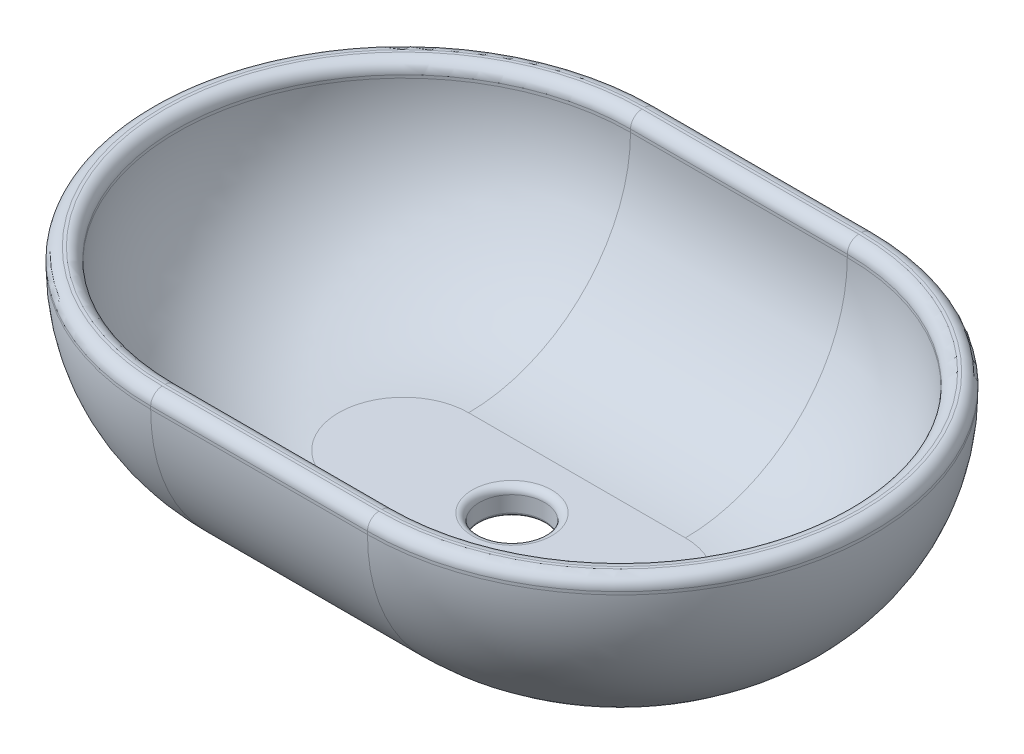
ISO-10303-21;
HEADER;
FILE_DESCRIPTION(('STEP AP214'),'2;1');
FILE_NAME('part.step','',(''),(''),'','','');
FILE_SCHEMA(('AUTOMOTIVE_DESIGN { 1 0 10303 214 1 1 1 1 }'));
ENDSEC;
DATA;
#1=APPLICATION_CONTEXT('core data for automotive mechanical design processes');
#2=APPLICATION_PROTOCOL_DEFINITION('international standard','automotive_design',2000,#1);
#3=PRODUCT_CONTEXT('',#1,'mechanical');
#4=PRODUCT('Part','Part','',(#3));
#5=PRODUCT_RELATED_PRODUCT_CATEGORY('part','',(#4));
#6=PRODUCT_DEFINITION_FORMATION('','',#4);
#7=PRODUCT_DEFINITION_CONTEXT('part definition',#1,'design');
#8=PRODUCT_DEFINITION('design','',#6,#7);
#9=PRODUCT_DEFINITION_SHAPE('','',#8);
#10=(LENGTH_UNIT() NAMED_UNIT(*) SI_UNIT(.MILLI.,.METRE.));
#11=(NAMED_UNIT(*) PLANE_ANGLE_UNIT() SI_UNIT($,.RADIAN.));
#12=(NAMED_UNIT(*) SI_UNIT($,.STERADIAN.) SOLID_ANGLE_UNIT());
#13=UNCERTAINTY_MEASURE_WITH_UNIT(LENGTH_MEASURE(1.E-05),#10,'distance_accuracy_value','');
#14=(GEOMETRIC_REPRESENTATION_CONTEXT(3) GLOBAL_UNCERTAINTY_ASSIGNED_CONTEXT((#13)) GLOBAL_UNIT_ASSIGNED_CONTEXT((#10,
#11,#12)) REPRESENTATION_CONTEXT('',''));
#15=CARTESIAN_POINT('',(0.,0.,0.));
#16=DIRECTION('',(0.,0.,1.));
#17=DIRECTION('',(1.,0.,0.));
#18=AXIS2_PLACEMENT_3D('',#15,#16,#17);
#19=CARTESIAN_POINT('',(-75.,140.,0.));
#20=DIRECTION('',(0.,-1.,0.));
#21=DIRECTION('',(0.,0.,-1.));
#22=AXIS2_PLACEMENT_3D('',#19,#20,#21);
#23=CYLINDRICAL_SURFACE('',#22,175.);
#24=DIRECTION('',(0.,-1.,0.));
#25=VECTOR('',#24,1.);
#26=CARTESIAN_POINT('',(-75.,140.,175.));
#27=LINE('',#26,#25);
#28=CARTESIAN_POINT('',(-75.,132.,175.));
#29=VERTEX_POINT('',#28);
#30=CARTESIAN_POINT('',(-75.,130.,175.));
#31=VERTEX_POINT('',#30);
#32=EDGE_CURVE('E235',#29,#31,#27,.T.);
#33=ORIENTED_EDGE('',*,*,#32,.F.);
#34=CARTESIAN_POINT('',(-75.,132.,0.));
#35=DIRECTION('',(0.,1.,0.));
#36=DIRECTION('',(0.,0.,1.));
#37=AXIS2_PLACEMENT_3D('',#34,#35,#36);
#38=CIRCLE('',#37,175.);
#39=CARTESIAN_POINT('',(-75.,132.,-175.));
#40=VERTEX_POINT('',#39);
#41=EDGE_CURVE('E11',#29,#40,#38,.F.);
#42=ORIENTED_EDGE('',*,*,#41,.T.);
#43=DIRECTION('',(0.,-1.,0.));
#44=VECTOR('',#43,1.);
#45=CARTESIAN_POINT('',(-75.,140.,-175.));
#46=LINE('',#45,#44);
#47=CARTESIAN_POINT('',(-75.,130.,-175.));
#48=VERTEX_POINT('',#47);
#49=EDGE_CURVE('E225',#40,#48,#46,.T.);
#50=ORIENTED_EDGE('',*,*,#49,.T.);
#51=CARTESIAN_POINT('',(-75.,130.,0.));
#52=DIRECTION('',(0.,1.,0.));
#53=DIRECTION('',(0.,0.,1.));
#54=AXIS2_PLACEMENT_3D('',#51,#52,#53);
#55=CIRCLE('',#54,175.);
#56=EDGE_CURVE('E238',#48,#31,#55,.T.);
#57=ORIENTED_EDGE('',*,*,#56,.T.);
#58=EDGE_LOOP('',(#33,#42,#50,#57));
#59=FACE_BOUND('',#58,.T.);
#60=ADVANCED_FACE('F41',(#59),#23,.T.);
#61=CARTESIAN_POINT('',(-75.,140.,175.));
#62=DIRECTION('',(0.,0.,-1.));
#63=DIRECTION('',(-1.,0.,0.));
#64=AXIS2_PLACEMENT_3D('',#61,#62,#63);
#65=PLANE('',#64);
#66=DIRECTION('',(0.,-1.,0.));
#67=VECTOR('',#66,1.);
#68=CARTESIAN_POINT('',(75.,140.,175.));
#69=LINE('',#68,#67);
#70=CARTESIAN_POINT('',(75.,132.,175.));
#71=VERTEX_POINT('',#70);
#72=CARTESIAN_POINT('',(75.,130.,175.));
#73=VERTEX_POINT('',#72);
#74=EDGE_CURVE('E232',#71,#73,#69,.T.);
#75=ORIENTED_EDGE('',*,*,#74,.F.);
#76=DIRECTION('',(1.,0.,0.));
#77=VECTOR('',#76,1.);
#78=CARTESIAN_POINT('',(-75.,132.,175.));
#79=LINE('',#78,#77);
#80=EDGE_CURVE('E59',#71,#29,#79,.F.);
#81=ORIENTED_EDGE('',*,*,#80,.T.);
#82=ORIENTED_EDGE('',*,*,#32,.T.);
#83=DIRECTION('',(1.,0.,0.));
#84=VECTOR('',#83,1.);
#85=CARTESIAN_POINT('',(-75.,130.,175.));
#86=LINE('',#85,#84);
#87=EDGE_CURVE('E263',#31,#73,#86,.T.);
#88=ORIENTED_EDGE('',*,*,#87,.T.);
#89=EDGE_LOOP('',(#75,#81,#82,#88));
#90=FACE_BOUND('',#89,.T.);
#91=ADVANCED_FACE('F404',(#90),#65,.F.);
#92=CARTESIAN_POINT('',(75.,140.,0.));
#93=DIRECTION('',(0.,-1.,0.));
#94=DIRECTION('',(0.,0.,-1.));
#95=AXIS2_PLACEMENT_3D('',#92,#93,#94);
#96=CYLINDRICAL_SURFACE('',#95,175.);
#97=DIRECTION('',(0.,-1.,0.));
#98=VECTOR('',#97,1.);
#99=CARTESIAN_POINT('',(75.,140.,-175.));
#100=LINE('',#99,#98);
#101=CARTESIAN_POINT('',(75.,132.,-175.));
#102=VERTEX_POINT('',#101);
#103=CARTESIAN_POINT('',(75.,130.,-175.));
#104=VERTEX_POINT('',#103);
#105=EDGE_CURVE('E228',#102,#104,#100,.T.);
#106=ORIENTED_EDGE('',*,*,#105,.F.);
#107=CARTESIAN_POINT('',(75.,132.,0.));
#108=DIRECTION('',(0.,1.,0.));
#109=DIRECTION('',(0.,0.,1.));
#110=AXIS2_PLACEMENT_3D('',#107,#108,#109);
#111=CIRCLE('',#110,175.);
#112=EDGE_CURVE('E67',#102,#71,#111,.F.);
#113=ORIENTED_EDGE('',*,*,#112,.T.);
#114=ORIENTED_EDGE('',*,*,#74,.T.);
#115=CARTESIAN_POINT('',(75.,130.,0.));
#116=DIRECTION('',(0.,1.,0.));
#117=DIRECTION('',(0.,0.,1.));
#118=AXIS2_PLACEMENT_3D('',#115,#116,#117);
#119=CIRCLE('',#118,175.);
#120=EDGE_CURVE('E259',#73,#104,#119,.T.);
#121=ORIENTED_EDGE('',*,*,#120,.T.);
#122=EDGE_LOOP('',(#106,#113,#114,#121));
#123=FACE_BOUND('',#122,.T.);
#124=ADVANCED_FACE('F400',(#123),#96,.T.);
#125=CARTESIAN_POINT('',(-75.,140.,-175.));
#126=DIRECTION('',(0.,0.,1.));
#127=DIRECTION('',(1.,0.,0.));
#128=AXIS2_PLACEMENT_3D('',#125,#126,#127);
#129=PLANE('',#128);
#130=ORIENTED_EDGE('',*,*,#49,.F.);
#131=DIRECTION('',(-1.,0.,0.));
#132=VECTOR('',#131,1.);
#133=CARTESIAN_POINT('',(75.,132.,-175.));
#134=LINE('',#133,#132);
#135=EDGE_CURVE('E331',#40,#102,#134,.F.);
#136=ORIENTED_EDGE('',*,*,#135,.T.);
#137=ORIENTED_EDGE('',*,*,#105,.T.);
#138=DIRECTION('',(-1.,0.,0.));
#139=VECTOR('',#138,1.);
#140=CARTESIAN_POINT('',(-75.,130.,-175.));
#141=LINE('',#140,#139);
#142=EDGE_CURVE('E255',#104,#48,#141,.T.);
#143=ORIENTED_EDGE('',*,*,#142,.T.);
#144=EDGE_LOOP('',(#130,#136,#137,#143));
#145=FACE_BOUND('',#144,.T.);
#146=ADVANCED_FACE('F381',(#145),#129,.F.);
#147=CARTESIAN_POINT('',(-75.,140.,0.));
#148=DIRECTION('',(0.,1.,0.));
#149=DIRECTION('',(0.,0.,1.));
#150=AXIS2_PLACEMENT_3D('',#147,#148,#149);
#151=PLANE('',#150);
#152=CARTESIAN_POINT('',(-75.,140.,0.));
#153=DIRECTION('',(0.,1.,0.));
#154=DIRECTION('',(0.,0.,1.));
#155=AXIS2_PLACEMENT_3D('',#152,#153,#154);
#156=CIRCLE('',#155,165.);
#157=CARTESIAN_POINT('',(-75.,140.,165.));
#158=VERTEX_POINT('',#157);
#159=CARTESIAN_POINT('',(-75.,140.,-165.));
#160=VERTEX_POINT('',#159);
#161=EDGE_CURVE('E313',#158,#160,#156,.F.);
#162=ORIENTED_EDGE('',*,*,#161,.T.);
#163=DIRECTION('',(-1.,0.,0.));
#164=VECTOR('',#163,1.);
#165=CARTESIAN_POINT('',(-75.,140.,-165.));
#166=LINE('',#165,#164);
#167=CARTESIAN_POINT('',(75.,140.,-165.));
#168=VERTEX_POINT('',#167);
#169=EDGE_CURVE('E322',#160,#168,#166,.F.);
#170=ORIENTED_EDGE('',*,*,#169,.T.);
#171=CARTESIAN_POINT('',(75.,140.,0.));
#172=DIRECTION('',(0.,1.,0.));
#173=DIRECTION('',(0.,0.,1.));
#174=AXIS2_PLACEMENT_3D('',#171,#172,#173);
#175=CIRCLE('',#174,165.);
#176=CARTESIAN_POINT('',(75.,140.,165.));
#177=VERTEX_POINT('',#176);
#178=EDGE_CURVE('E319',#168,#177,#175,.F.);
#179=ORIENTED_EDGE('',*,*,#178,.T.);
#180=DIRECTION('',(1.,0.,0.));
#181=VECTOR('',#180,1.);
#182=CARTESIAN_POINT('',(-75.,140.,165.));
#183=LINE('',#182,#181);
#184=EDGE_CURVE('E316',#177,#158,#183,.F.);
#185=ORIENTED_EDGE('',*,*,#184,.T.);
#186=EDGE_LOOP('',(#162,#170,#179,#185));
#187=FACE_BOUND('',#186,.T.);
#188=CARTESIAN_POINT('',(75.,140.,0.));
#189=DIRECTION('',(0.,1.,0.));
#190=DIRECTION('',(0.,0.,1.));
#191=AXIS2_PLACEMENT_3D('',#188,#189,#190);
#192=CIRCLE('',#191,167.);
#193=CARTESIAN_POINT('',(75.,140.,167.));
#194=VERTEX_POINT('',#193);
#195=CARTESIAN_POINT('',(75.,140.,-167.));
#196=VERTEX_POINT('',#195);
#197=EDGE_CURVE('E306',#194,#196,#192,.T.);
#198=ORIENTED_EDGE('',*,*,#197,.T.);
#199=DIRECTION('',(-1.,0.,0.));
#200=VECTOR('',#199,1.);
#201=CARTESIAN_POINT('',(-75.,140.,-167.));
#202=LINE('',#201,#200);
#203=CARTESIAN_POINT('',(-75.,140.,-167.));
#204=VERTEX_POINT('',#203);
#205=EDGE_CURVE('E309',#196,#204,#202,.T.);
#206=ORIENTED_EDGE('',*,*,#205,.T.);
#207=CARTESIAN_POINT('',(-75.,140.,0.));
#208=DIRECTION('',(0.,1.,0.));
#209=DIRECTION('',(0.,0.,1.));
#210=AXIS2_PLACEMENT_3D('',#207,#208,#209);
#211=CIRCLE('',#210,167.);
#212=CARTESIAN_POINT('',(-75.,140.,167.));
#213=VERTEX_POINT('',#212);
#214=EDGE_CURVE('E300',#204,#213,#211,.T.);
#215=ORIENTED_EDGE('',*,*,#214,.T.);
#216=DIRECTION('',(1.,0.,0.));
#217=VECTOR('',#216,1.);
#218=CARTESIAN_POINT('',(75.,140.,167.));
#219=LINE('',#218,#217);
#220=EDGE_CURVE('E303',#213,#194,#219,.T.);
#221=ORIENTED_EDGE('',*,*,#220,.T.);
#222=EDGE_LOOP('',(#198,#206,#215,#221));
#223=FACE_BOUND('',#222,.T.);
#224=ADVANCED_FACE('F388',(#187,#223),#151,.T.);
#225=CARTESIAN_POINT('',(-75.,0.,0.));
#226=DIRECTION('',(0.,1.,0.));
#227=DIRECTION('',(0.,0.,1.));
#228=AXIS2_PLACEMENT_3D('',#225,#226,#227);
#229=PLANE('',#228);
#230=CARTESIAN_POINT('',(0.,0.,0.));
#231=DIRECTION('',(0.,1.,0.));
#232=DIRECTION('',(0.,0.,1.));
#233=AXIS2_PLACEMENT_3D('',#230,#231,#232);
#234=CIRCLE('',#233,24.5);
#235=CARTESIAN_POINT('',(0.,0.,24.5));
#236=VERTEX_POINT('',#235);
#237=EDGE_CURVE('E288',#236,#236,#234,.T.);
#238=ORIENTED_EDGE('',*,*,#237,.T.);
#239=EDGE_LOOP('',(#238));
#240=FACE_BOUND('',#239,.T.);
#241=DIRECTION('',(1.,0.,0.));
#242=VECTOR('',#241,1.);
#243=CARTESIAN_POINT('',(-75.,0.,45.));
#244=LINE('',#243,#242);
#245=CARTESIAN_POINT('',(75.,0.,45.));
#246=VERTEX_POINT('',#245);
#247=CARTESIAN_POINT('',(-75.,0.,45.));
#248=VERTEX_POINT('',#247);
#249=EDGE_CURVE('E242',#246,#248,#244,.F.);
#250=ORIENTED_EDGE('',*,*,#249,.T.);
#251=CARTESIAN_POINT('',(-75.,0.,0.));
#252=DIRECTION('',(0.,1.,0.));
#253=DIRECTION('',(0.,0.,1.));
#254=AXIS2_PLACEMENT_3D('',#251,#252,#253);
#255=CIRCLE('',#254,45.);
#256=CARTESIAN_POINT('',(-75.,0.,-45.));
#257=VERTEX_POINT('',#256);
#258=EDGE_CURVE('E251',#248,#257,#255,.F.);
#259=ORIENTED_EDGE('',*,*,#258,.T.);
#260=DIRECTION('',(-1.,0.,0.));
#261=VECTOR('',#260,1.);
#262=CARTESIAN_POINT('',(-75.,0.,-45.));
#263=LINE('',#262,#261);
#264=CARTESIAN_POINT('',(75.,0.,-45.));
#265=VERTEX_POINT('',#264);
#266=EDGE_CURVE('E248',#257,#265,#263,.F.);
#267=ORIENTED_EDGE('',*,*,#266,.T.);
#268=CARTESIAN_POINT('',(75.,0.,0.));
#269=DIRECTION('',(0.,1.,0.));
#270=DIRECTION('',(0.,0.,1.));
#271=AXIS2_PLACEMENT_3D('',#268,#269,#270);
#272=CIRCLE('',#271,45.);
#273=EDGE_CURVE('E245',#265,#246,#272,.F.);
#274=ORIENTED_EDGE('',*,*,#273,.T.);
#275=EDGE_LOOP('',(#250,#259,#267,#274));
#276=FACE_BOUND('',#275,.T.);
#277=ADVANCED_FACE('F390',(#240,#276),#229,.F.);
#278=CARTESIAN_POINT('',(75.,130.,0.));
#279=DIRECTION('',(0.,1.,0.));
#280=DIRECTION('',(0.,0.,1.));
#281=AXIS2_PLACEMENT_3D('',#278,#279,#280);
#282=DEGENERATE_TOROIDAL_SURFACE('',#281,45.,130.,.T.);
#283=CARTESIAN_POINT('',(75.,130.,45.));
#284=DIRECTION('',(-1.,0.,0.));
#285=DIRECTION('',(0.,0.,1.));
#286=AXIS2_PLACEMENT_3D('',#283,#284,#285);
#287=CIRCLE('',#286,130.);
#288=EDGE_CURVE('E274',#246,#73,#287,.T.);
#289=ORIENTED_EDGE('',*,*,#288,.F.);
#290=ORIENTED_EDGE('',*,*,#273,.F.);
#291=CARTESIAN_POINT('',(75.,130.,-45.));
#292=DIRECTION('',(-1.,0.,0.));
#293=DIRECTION('',(0.,0.,1.));
#294=AXIS2_PLACEMENT_3D('',#291,#292,#293);
#295=CIRCLE('',#294,130.);
#296=EDGE_CURVE('E229',#104,#265,#295,.T.);
#297=ORIENTED_EDGE('',*,*,#296,.F.);
#298=ORIENTED_EDGE('',*,*,#120,.F.);
#299=EDGE_LOOP('',(#289,#290,#297,#298));
#300=FACE_BOUND('',#299,.T.);
#301=ADVANCED_FACE('F397',(#300),#282,.T.);
#302=CARTESIAN_POINT('',(-75.,130.,-45.));
#303=DIRECTION('',(-1.,0.,0.));
#304=DIRECTION('',(0.,0.,1.));
#305=AXIS2_PLACEMENT_3D('',#302,#303,#304);
#306=CYLINDRICAL_SURFACE('',#305,130.);
#307=ORIENTED_EDGE('',*,*,#296,.T.);
#308=ORIENTED_EDGE('',*,*,#266,.F.);
#309=CARTESIAN_POINT('',(-75.,130.,-45.));
#310=DIRECTION('',(-1.,0.,0.));
#311=DIRECTION('',(0.,-1.,0.));
#312=AXIS2_PLACEMENT_3D('',#309,#310,#311);
#313=CIRCLE('',#312,130.);
#314=EDGE_CURVE('E271',#48,#257,#313,.T.);
#315=ORIENTED_EDGE('',*,*,#314,.F.);
#316=ORIENTED_EDGE('',*,*,#142,.F.);
#317=EDGE_LOOP('',(#307,#308,#315,#316));
#318=FACE_BOUND('',#317,.T.);
#319=ADVANCED_FACE('F420',(#318),#306,.T.);
#320=CARTESIAN_POINT('',(-75.,130.,45.));
#321=DIRECTION('',(1.,0.,0.));
#322=DIRECTION('',(0.,0.,-1.));
#323=AXIS2_PLACEMENT_3D('',#320,#321,#322);
#324=CYLINDRICAL_SURFACE('',#323,130.);
#325=ORIENTED_EDGE('',*,*,#288,.T.);
#326=ORIENTED_EDGE('',*,*,#87,.F.);
#327=CARTESIAN_POINT('',(-75.,130.,45.));
#328=DIRECTION('',(-1.,0.,0.));
#329=DIRECTION('',(0.,0.,1.));
#330=AXIS2_PLACEMENT_3D('',#327,#328,#329);
#331=CIRCLE('',#330,130.);
#332=EDGE_CURVE('E182',#248,#31,#331,.T.);
#333=ORIENTED_EDGE('',*,*,#332,.F.);
#334=ORIENTED_EDGE('',*,*,#249,.F.);
#335=EDGE_LOOP('',(#325,#326,#333,#334));
#336=FACE_BOUND('',#335,.T.);
#337=ADVANCED_FACE('F416',(#336),#324,.T.);
#338=CARTESIAN_POINT('',(-75.,130.,0.));
#339=DIRECTION('',(0.,1.,0.));
#340=DIRECTION('',(0.,0.,1.));
#341=AXIS2_PLACEMENT_3D('',#338,#339,#340);
#342=DEGENERATE_TOROIDAL_SURFACE('',#341,45.,130.,.T.);
#343=ORIENTED_EDGE('',*,*,#314,.T.);
#344=ORIENTED_EDGE('',*,*,#258,.F.);
#345=ORIENTED_EDGE('',*,*,#332,.T.);
#346=ORIENTED_EDGE('',*,*,#56,.F.);
#347=EDGE_LOOP('',(#343,#344,#345,#346));
#348=FACE_BOUND('',#347,.T.);
#349=ADVANCED_FACE('F412',(#348),#342,.T.);
#350=CARTESIAN_POINT('',(-75.,140.,0.));
#351=DIRECTION('',(0.,-1.,0.));
#352=DIRECTION('',(0.,0.,-1.));
#353=AXIS2_PLACEMENT_3D('',#350,#351,#352);
#354=CYLINDRICAL_SURFACE('',#353,157.);
#355=DIRECTION('',(0.,-1.,0.));
#356=VECTOR('',#355,1.);
#357=CARTESIAN_POINT('',(-75.,140.,-157.));
#358=LINE('',#357,#356);
#359=CARTESIAN_POINT('',(-75.,132.,-157.));
#360=VERTEX_POINT('',#359);
#361=CARTESIAN_POINT('',(-75.,130.,-157.));
#362=VERTEX_POINT('',#361);
#363=EDGE_CURVE('E203',#360,#362,#358,.T.);
#364=ORIENTED_EDGE('',*,*,#363,.F.);
#365=CARTESIAN_POINT('',(-75.,132.,0.));
#366=DIRECTION('',(0.,1.,0.));
#367=DIRECTION('',(0.,0.,1.));
#368=AXIS2_PLACEMENT_3D('',#365,#366,#367);
#369=CIRCLE('',#368,157.);
#370=CARTESIAN_POINT('',(-75.,132.,157.));
#371=VERTEX_POINT('',#370);
#372=EDGE_CURVE('E51',#360,#371,#369,.T.);
#373=ORIENTED_EDGE('',*,*,#372,.T.);
#374=DIRECTION('',(0.,1.,0.));
#375=VECTOR('',#374,1.);
#376=CARTESIAN_POINT('',(-75.,140.,157.));
#377=LINE('',#376,#375);
#378=CARTESIAN_POINT('',(-75.,130.,157.));
#379=VERTEX_POINT('',#378);
#380=EDGE_CURVE('E169',#371,#379,#377,.F.);
#381=ORIENTED_EDGE('',*,*,#380,.T.);
#382=CARTESIAN_POINT('',(-75.,130.,0.));
#383=DIRECTION('',(0.,-1.,0.));
#384=DIRECTION('',(0.,0.,-1.));
#385=AXIS2_PLACEMENT_3D('',#382,#383,#384);
#386=CIRCLE('',#385,157.);
#387=EDGE_CURVE('E215',#362,#379,#386,.F.);
#388=ORIENTED_EDGE('',*,*,#387,.F.);
#389=EDGE_LOOP('',(#364,#373,#381,#388));
#390=FACE_BOUND('',#389,.T.);
#391=ADVANCED_FACE('F415',(#390),#354,.F.);
#392=CARTESIAN_POINT('',(-75.,140.,157.));
#393=DIRECTION('',(0.,0.,-1.));
#394=DIRECTION('',(-1.,0.,0.));
#395=AXIS2_PLACEMENT_3D('',#392,#393,#394);
#396=PLANE('',#395);
#397=ORIENTED_EDGE('',*,*,#380,.F.);
#398=DIRECTION('',(1.,0.,0.));
#399=VECTOR('',#398,1.);
#400=CARTESIAN_POINT('',(-75.,132.,157.));
#401=LINE('',#400,#399);
#402=CARTESIAN_POINT('',(75.,132.,157.));
#403=VERTEX_POINT('',#402);
#404=EDGE_CURVE('E164',#371,#403,#401,.T.);
#405=ORIENTED_EDGE('',*,*,#404,.T.);
#406=DIRECTION('',(0.,-1.,0.));
#407=VECTOR('',#406,1.);
#408=CARTESIAN_POINT('',(75.,140.,157.));
#409=LINE('',#408,#407);
#410=CARTESIAN_POINT('',(75.,130.,157.));
#411=VERTEX_POINT('',#410);
#412=EDGE_CURVE('E157',#403,#411,#409,.T.);
#413=ORIENTED_EDGE('',*,*,#412,.T.);
#414=DIRECTION('',(-1.,0.,0.));
#415=VECTOR('',#414,1.);
#416=CARTESIAN_POINT('',(-75.,130.,157.));
#417=LINE('',#416,#415);
#418=EDGE_CURVE('E161',#379,#411,#417,.F.);
#419=ORIENTED_EDGE('',*,*,#418,.F.);
#420=EDGE_LOOP('',(#397,#405,#413,#419));
#421=FACE_BOUND('',#420,.T.);
#422=ADVANCED_FACE('F160',(#421),#396,.T.);
#423=CARTESIAN_POINT('',(75.,140.,0.));
#424=DIRECTION('',(0.,-1.,0.));
#425=DIRECTION('',(0.,0.,-1.));
#426=AXIS2_PLACEMENT_3D('',#423,#424,#425);
#427=CYLINDRICAL_SURFACE('',#426,157.);
#428=ORIENTED_EDGE('',*,*,#412,.F.);
#429=CARTESIAN_POINT('',(75.,132.,0.));
#430=DIRECTION('',(0.,1.,0.));
#431=DIRECTION('',(0.,0.,1.));
#432=AXIS2_PLACEMENT_3D('',#429,#430,#431);
#433=CIRCLE('',#432,157.);
#434=CARTESIAN_POINT('',(75.,132.,-157.));
#435=VERTEX_POINT('',#434);
#436=EDGE_CURVE('E326',#403,#435,#433,.T.);
#437=ORIENTED_EDGE('',*,*,#436,.T.);
#438=DIRECTION('',(0.,1.,0.));
#439=VECTOR('',#438,1.);
#440=CARTESIAN_POINT('',(75.,140.,-157.));
#441=LINE('',#440,#439);
#442=CARTESIAN_POINT('',(75.,130.,-157.));
#443=VERTEX_POINT('',#442);
#444=EDGE_CURVE('E170',#435,#443,#441,.F.);
#445=ORIENTED_EDGE('',*,*,#444,.T.);
#446=CARTESIAN_POINT('',(75.,130.,0.));
#447=DIRECTION('',(0.,-1.,0.));
#448=DIRECTION('',(0.,0.,-1.));
#449=AXIS2_PLACEMENT_3D('',#446,#447,#448);
#450=CIRCLE('',#449,157.);
#451=EDGE_CURVE('E183',#411,#443,#450,.F.);
#452=ORIENTED_EDGE('',*,*,#451,.F.);
#453=EDGE_LOOP('',(#428,#437,#445,#452));
#454=FACE_BOUND('',#453,.T.);
#455=ADVANCED_FACE('F186',(#454),#427,.F.);
#456=CARTESIAN_POINT('',(-75.,140.,-157.));
#457=DIRECTION('',(0.,0.,1.));
#458=DIRECTION('',(1.,0.,0.));
#459=AXIS2_PLACEMENT_3D('',#456,#457,#458);
#460=PLANE('',#459);
#461=ORIENTED_EDGE('',*,*,#444,.F.);
#462=DIRECTION('',(-1.,0.,0.));
#463=VECTOR('',#462,1.);
#464=CARTESIAN_POINT('',(-75.,132.,-157.));
#465=LINE('',#464,#463);
#466=EDGE_CURVE('E296',#435,#360,#465,.T.);
#467=ORIENTED_EDGE('',*,*,#466,.T.);
#468=ORIENTED_EDGE('',*,*,#363,.T.);
#469=DIRECTION('',(1.,0.,0.));
#470=VECTOR('',#469,1.);
#471=CARTESIAN_POINT('',(-75.,130.,-157.));
#472=LINE('',#471,#470);
#473=EDGE_CURVE('E192',#443,#362,#472,.F.);
#474=ORIENTED_EDGE('',*,*,#473,.F.);
#475=EDGE_LOOP('',(#461,#467,#468,#474));
#476=FACE_BOUND('',#475,.T.);
#477=ADVANCED_FACE('F530',(#476),#460,.T.);
#478=CARTESIAN_POINT('',(-75.,18.,0.));
#479=DIRECTION('',(0.,1.,0.));
#480=DIRECTION('',(0.,0.,1.));
#481=AXIS2_PLACEMENT_3D('',#478,#479,#480);
#482=PLANE('',#481);
#483=CARTESIAN_POINT('',(0.,18.,0.));
#484=DIRECTION('',(0.,1.,0.));
#485=DIRECTION('',(0.,0.,1.));
#486=AXIS2_PLACEMENT_3D('',#483,#484,#485);
#487=CIRCLE('',#486,27.5);
#488=CARTESIAN_POINT('',(0.,18.,27.5));
#489=VERTEX_POINT('',#488);
#490=EDGE_CURVE('E284',#489,#489,#487,.F.);
#491=ORIENTED_EDGE('',*,*,#490,.T.);
#492=EDGE_LOOP('',(#491));
#493=FACE_BOUND('',#492,.T.);
#494=DIRECTION('',(1.,0.,0.));
#495=VECTOR('',#494,1.);
#496=CARTESIAN_POINT('',(-75.,18.,45.));
#497=LINE('',#496,#495);
#498=CARTESIAN_POINT('',(75.,18.,45.));
#499=VERTEX_POINT('',#498);
#500=CARTESIAN_POINT('',(-75.,18.,45.));
#501=VERTEX_POINT('',#500);
#502=EDGE_CURVE('E211',#499,#501,#497,.F.);
#503=ORIENTED_EDGE('',*,*,#502,.F.);
#504=CARTESIAN_POINT('',(75.,18.,0.));
#505=DIRECTION('',(0.,1.,0.));
#506=DIRECTION('',(0.,0.,1.));
#507=AXIS2_PLACEMENT_3D('',#504,#505,#506);
#508=CIRCLE('',#507,45.);
#509=CARTESIAN_POINT('',(75.,18.,-45.));
#510=VERTEX_POINT('',#509);
#511=EDGE_CURVE('E196',#510,#499,#508,.F.);
#512=ORIENTED_EDGE('',*,*,#511,.F.);
#513=DIRECTION('',(1.,0.,0.));
#514=VECTOR('',#513,1.);
#515=CARTESIAN_POINT('',(-75.,18.,-45.));
#516=LINE('',#515,#514);
#517=CARTESIAN_POINT('',(-75.,18.,-45.));
#518=VERTEX_POINT('',#517);
#519=EDGE_CURVE('E210',#518,#510,#516,.T.);
#520=ORIENTED_EDGE('',*,*,#519,.F.);
#521=CARTESIAN_POINT('',(-75.,18.,0.));
#522=DIRECTION('',(0.,1.,0.));
#523=DIRECTION('',(0.,0.,1.));
#524=AXIS2_PLACEMENT_3D('',#521,#522,#523);
#525=CIRCLE('',#524,45.);
#526=EDGE_CURVE('E216',#501,#518,#525,.F.);
#527=ORIENTED_EDGE('',*,*,#526,.F.);
#528=EDGE_LOOP('',(#503,#512,#520,#527));
#529=FACE_BOUND('',#528,.T.);
#530=ADVANCED_FACE('F523',(#493,#529),#482,.T.);
#531=CARTESIAN_POINT('',(75.,130.,0.));
#532=DIRECTION('',(0.,1.,0.));
#533=DIRECTION('',(0.,0.,1.));
#534=AXIS2_PLACEMENT_3D('',#531,#532,#533);
#535=DEGENERATE_TOROIDAL_SURFACE('',#534,45.,112.,.T.);
#536=CARTESIAN_POINT('',(75.,130.,45.));
#537=DIRECTION('',(1.,0.,0.));
#538=DIRECTION('',(0.,0.,-1.));
#539=AXIS2_PLACEMENT_3D('',#536,#537,#538);
#540=CIRCLE('',#539,112.);
#541=EDGE_CURVE('E177',#499,#411,#540,.F.);
#542=ORIENTED_EDGE('',*,*,#541,.T.);
#543=ORIENTED_EDGE('',*,*,#451,.T.);
#544=CARTESIAN_POINT('',(75.,130.,-45.));
#545=DIRECTION('',(-1.,0.,0.));
#546=DIRECTION('',(0.,0.,1.));
#547=AXIS2_PLACEMENT_3D('',#544,#545,#546);
#548=CIRCLE('',#547,112.);
#549=EDGE_CURVE('E198',#443,#510,#548,.T.);
#550=ORIENTED_EDGE('',*,*,#549,.T.);
#551=ORIENTED_EDGE('',*,*,#511,.T.);
#552=EDGE_LOOP('',(#542,#543,#550,#551));
#553=FACE_BOUND('',#552,.T.);
#554=ADVANCED_FACE('F194',(#553),#535,.F.);
#555=CARTESIAN_POINT('',(-75.,130.,-45.));
#556=DIRECTION('',(-1.,0.,0.));
#557=DIRECTION('',(0.,0.,1.));
#558=AXIS2_PLACEMENT_3D('',#555,#556,#557);
#559=CYLINDRICAL_SURFACE('',#558,112.);
#560=ORIENTED_EDGE('',*,*,#549,.F.);
#561=ORIENTED_EDGE('',*,*,#473,.T.);
#562=CARTESIAN_POINT('',(-75.,130.,-45.));
#563=DIRECTION('',(1.,0.,0.));
#564=DIRECTION('',(0.,0.,-1.));
#565=AXIS2_PLACEMENT_3D('',#562,#563,#564);
#566=CIRCLE('',#565,112.);
#567=EDGE_CURVE('E199',#362,#518,#566,.F.);
#568=ORIENTED_EDGE('',*,*,#567,.T.);
#569=ORIENTED_EDGE('',*,*,#519,.T.);
#570=EDGE_LOOP('',(#560,#561,#568,#569));
#571=FACE_BOUND('',#570,.T.);
#572=ADVANCED_FACE('F509',(#571),#559,.F.);
#573=CARTESIAN_POINT('',(-75.,130.,45.));
#574=DIRECTION('',(1.,0.,0.));
#575=DIRECTION('',(0.,0.,-1.));
#576=AXIS2_PLACEMENT_3D('',#573,#574,#575);
#577=CYLINDRICAL_SURFACE('',#576,112.);
#578=ORIENTED_EDGE('',*,*,#541,.F.);
#579=ORIENTED_EDGE('',*,*,#502,.T.);
#580=CARTESIAN_POINT('',(-75.,130.,45.));
#581=DIRECTION('',(-1.,0.,0.));
#582=DIRECTION('',(0.,0.,1.));
#583=AXIS2_PLACEMENT_3D('',#580,#581,#582);
#584=CIRCLE('',#583,112.);
#585=EDGE_CURVE('E180',#501,#379,#584,.T.);
#586=ORIENTED_EDGE('',*,*,#585,.T.);
#587=ORIENTED_EDGE('',*,*,#418,.T.);
#588=EDGE_LOOP('',(#578,#579,#586,#587));
#589=FACE_BOUND('',#588,.T.);
#590=ADVANCED_FACE('F175',(#589),#577,.F.);
#591=CARTESIAN_POINT('',(-75.,130.,0.));
#592=DIRECTION('',(0.,1.,0.));
#593=DIRECTION('',(0.,0.,1.));
#594=AXIS2_PLACEMENT_3D('',#591,#592,#593);
#595=DEGENERATE_TOROIDAL_SURFACE('',#594,45.,112.,.T.);
#596=ORIENTED_EDGE('',*,*,#567,.F.);
#597=ORIENTED_EDGE('',*,*,#387,.T.);
#598=ORIENTED_EDGE('',*,*,#585,.F.);
#599=ORIENTED_EDGE('',*,*,#526,.T.);
#600=EDGE_LOOP('',(#596,#597,#598,#599));
#601=FACE_BOUND('',#600,.T.);
#602=ADVANCED_FACE('F495',(#601),#595,.F.);
#603=CARTESIAN_POINT('',(0.,-122.,0.));
#604=DIRECTION('',(0.,1.,0.));
#605=DIRECTION('',(0.,0.,1.));
#606=AXIS2_PLACEMENT_3D('',#603,#604,#605);
#607=CYLINDRICAL_SURFACE('',#606,22.5);
#608=CARTESIAN_POINT('',(0.,2.,0.));
#609=DIRECTION('',(0.,1.,0.));
#610=DIRECTION('',(0.,0.,1.));
#611=AXIS2_PLACEMENT_3D('',#608,#609,#610);
#612=CIRCLE('',#611,22.5);
#613=CARTESIAN_POINT('',(0.,2.,22.5));
#614=VERTEX_POINT('',#613);
#615=EDGE_CURVE('E292',#614,#614,#612,.F.);
#616=ORIENTED_EDGE('',*,*,#615,.T.);
#617=EDGE_LOOP('',(#616));
#618=FACE_BOUND('',#617,.T.);
#619=CARTESIAN_POINT('',(0.,13.,0.));
#620=DIRECTION('',(0.,1.,0.));
#621=DIRECTION('',(0.,0.,1.));
#622=AXIS2_PLACEMENT_3D('',#619,#620,#621);
#623=CIRCLE('',#622,22.5);
#624=CARTESIAN_POINT('',(0.,13.,22.5));
#625=VERTEX_POINT('',#624);
#626=EDGE_CURVE('E267',#625,#625,#623,.T.);
#627=ORIENTED_EDGE('',*,*,#626,.T.);
#628=EDGE_LOOP('',(#627));
#629=FACE_BOUND('',#628,.T.);
#630=ADVANCED_FACE('F432',(#618,#629),#607,.F.);
#631=CARTESIAN_POINT('',(0.,13.,0.));
#632=DIRECTION('',(0.,1.,0.));
#633=DIRECTION('',(0.,0.,1.));
#634=AXIS2_PLACEMENT_3D('',#631,#632,#633);
#635=TOROIDAL_SURFACE('',#634,27.5,5.);
#636=ORIENTED_EDGE('',*,*,#490,.F.);
#637=EDGE_LOOP('',(#636));
#638=FACE_BOUND('',#637,.T.);
#639=ORIENTED_EDGE('',*,*,#626,.F.);
#640=EDGE_LOOP('',(#639));
#641=FACE_BOUND('',#640,.T.);
#642=ADVANCED_FACE('F428',(#638,#641),#635,.T.);
#643=CARTESIAN_POINT('',(0.,2.,0.));
#644=DIRECTION('',(0.,1.,0.));
#645=DIRECTION('',(0.,0.,1.));
#646=AXIS2_PLACEMENT_3D('',#643,#644,#645);
#647=TOROIDAL_SURFACE('',#646,24.5,2.);
#648=ORIENTED_EDGE('',*,*,#615,.F.);
#649=EDGE_LOOP('',(#648));
#650=FACE_BOUND('',#649,.T.);
#651=ORIENTED_EDGE('',*,*,#237,.F.);
#652=EDGE_LOOP('',(#651));
#653=FACE_BOUND('',#652,.T.);
#654=ADVANCED_FACE('F431',(#650,#653),#647,.T.);
#655=CARTESIAN_POINT('',(-75.,132.,165.));
#656=DIRECTION('',(1.,0.,0.));
#657=DIRECTION('',(0.,0.,-1.));
#658=AXIS2_PLACEMENT_3D('',#655,#656,#657);
#659=CYLINDRICAL_SURFACE('',#658,8.);
#660=CARTESIAN_POINT('',(-75.,132.,165.));
#661=DIRECTION('',(-1.,0.,0.));
#662=DIRECTION('',(0.,0.,1.));
#663=AXIS2_PLACEMENT_3D('',#660,#661,#662);
#664=CIRCLE('',#663,8.);
#665=EDGE_CURVE('E347',#158,#371,#664,.T.);
#666=ORIENTED_EDGE('',*,*,#665,.F.);
#667=ORIENTED_EDGE('',*,*,#184,.F.);
#668=CARTESIAN_POINT('',(75.,132.,165.));
#669=DIRECTION('',(1.,0.,0.));
#670=DIRECTION('',(0.,0.,-1.));
#671=AXIS2_PLACEMENT_3D('',#668,#669,#670);
#672=CIRCLE('',#671,8.);
#673=EDGE_CURVE('E224',#403,#177,#672,.T.);
#674=ORIENTED_EDGE('',*,*,#673,.F.);
#675=ORIENTED_EDGE('',*,*,#404,.F.);
#676=EDGE_LOOP('',(#666,#667,#674,#675));
#677=FACE_BOUND('',#676,.T.);
#678=ADVANCED_FACE('F436',(#677),#659,.T.);
#679=CARTESIAN_POINT('',(75.,132.,0.));
#680=DIRECTION('',(0.,1.,0.));
#681=DIRECTION('',(0.,0.,1.));
#682=AXIS2_PLACEMENT_3D('',#679,#680,#681);
#683=TOROIDAL_SURFACE('',#682,165.,8.);
#684=ORIENTED_EDGE('',*,*,#673,.T.);
#685=ORIENTED_EDGE('',*,*,#178,.F.);
#686=CARTESIAN_POINT('',(75.,132.,-165.));
#687=DIRECTION('',(-1.,0.,0.));
#688=DIRECTION('',(0.,0.,1.));
#689=AXIS2_PLACEMENT_3D('',#686,#687,#688);
#690=CIRCLE('',#689,8.);
#691=EDGE_CURVE('E344',#435,#168,#690,.T.);
#692=ORIENTED_EDGE('',*,*,#691,.F.);
#693=ORIENTED_EDGE('',*,*,#436,.F.);
#694=EDGE_LOOP('',(#684,#685,#692,#693));
#695=FACE_BOUND('',#694,.T.);
#696=ADVANCED_FACE('F445',(#695),#683,.T.);
#697=CARTESIAN_POINT('',(-75.,132.,0.));
#698=DIRECTION('',(0.,1.,0.));
#699=DIRECTION('',(0.,0.,1.));
#700=AXIS2_PLACEMENT_3D('',#697,#698,#699);
#701=TOROIDAL_SURFACE('',#700,165.,8.);
#702=ORIENTED_EDGE('',*,*,#665,.T.);
#703=ORIENTED_EDGE('',*,*,#372,.F.);
#704=CARTESIAN_POINT('',(-75.,132.,-165.));
#705=DIRECTION('',(1.,0.,0.));
#706=DIRECTION('',(0.,0.,-1.));
#707=AXIS2_PLACEMENT_3D('',#704,#705,#706);
#708=CIRCLE('',#707,8.);
#709=EDGE_CURVE('E341',#160,#360,#708,.T.);
#710=ORIENTED_EDGE('',*,*,#709,.F.);
#711=ORIENTED_EDGE('',*,*,#161,.F.);
#712=EDGE_LOOP('',(#702,#703,#710,#711));
#713=FACE_BOUND('',#712,.T.);
#714=ADVANCED_FACE('F441',(#713),#701,.T.);
#715=CARTESIAN_POINT('',(-75.,132.,-165.));
#716=DIRECTION('',(-1.,0.,0.));
#717=DIRECTION('',(0.,0.,1.));
#718=AXIS2_PLACEMENT_3D('',#715,#716,#717);
#719=CYLINDRICAL_SURFACE('',#718,8.);
#720=ORIENTED_EDGE('',*,*,#691,.T.);
#721=ORIENTED_EDGE('',*,*,#169,.F.);
#722=ORIENTED_EDGE('',*,*,#709,.T.);
#723=ORIENTED_EDGE('',*,*,#466,.F.);
#724=EDGE_LOOP('',(#720,#721,#722,#723));
#725=FACE_BOUND('',#724,.T.);
#726=ADVANCED_FACE('F438',(#725),#719,.T.);
#727=CARTESIAN_POINT('',(-75.,132.,167.));
#728=DIRECTION('',(-1.,0.,0.));
#729=DIRECTION('',(0.,0.,1.));
#730=AXIS2_PLACEMENT_3D('',#727,#728,#729);
#731=CYLINDRICAL_SURFACE('',#730,8.);
#732=CARTESIAN_POINT('',(-75.,132.,167.));
#733=DIRECTION('',(-1.,0.,0.));
#734=DIRECTION('',(0.,0.,1.));
#735=AXIS2_PLACEMENT_3D('',#732,#733,#734);
#736=CIRCLE('',#735,8.);
#737=EDGE_CURVE('E359',#29,#213,#736,.T.);
#738=ORIENTED_EDGE('',*,*,#737,.F.);
#739=ORIENTED_EDGE('',*,*,#80,.F.);
#740=CARTESIAN_POINT('',(75.,132.,167.));
#741=DIRECTION('',(1.,0.,0.));
#742=DIRECTION('',(0.,0.,-1.));
#743=AXIS2_PLACEMENT_3D('',#740,#741,#742);
#744=CIRCLE('',#743,8.);
#745=EDGE_CURVE('E45',#194,#71,#744,.T.);
#746=ORIENTED_EDGE('',*,*,#745,.F.);
#747=ORIENTED_EDGE('',*,*,#220,.F.);
#748=EDGE_LOOP('',(#738,#739,#746,#747));
#749=FACE_BOUND('',#748,.T.);
#750=ADVANCED_FACE('F43',(#749),#731,.T.);
#751=CARTESIAN_POINT('',(75.,132.,0.));
#752=DIRECTION('',(0.,1.,0.));
#753=DIRECTION('',(0.,0.,1.));
#754=AXIS2_PLACEMENT_3D('',#751,#752,#753);
#755=TOROIDAL_SURFACE('',#754,167.,8.);
#756=ORIENTED_EDGE('',*,*,#745,.T.);
#757=ORIENTED_EDGE('',*,*,#112,.F.);
#758=CARTESIAN_POINT('',(75.,132.,-167.));
#759=DIRECTION('',(-1.,0.,0.));
#760=DIRECTION('',(0.,0.,1.));
#761=AXIS2_PLACEMENT_3D('',#758,#759,#760);
#762=CIRCLE('',#761,8.);
#763=EDGE_CURVE('E357',#196,#102,#762,.T.);
#764=ORIENTED_EDGE('',*,*,#763,.F.);
#765=ORIENTED_EDGE('',*,*,#197,.F.);
#766=EDGE_LOOP('',(#756,#757,#764,#765));
#767=FACE_BOUND('',#766,.T.);
#768=ADVANCED_FACE('F371',(#767),#755,.T.);
#769=CARTESIAN_POINT('',(-75.,132.,0.));
#770=DIRECTION('',(0.,1.,0.));
#771=DIRECTION('',(0.,0.,1.));
#772=AXIS2_PLACEMENT_3D('',#769,#770,#771);
#773=TOROIDAL_SURFACE('',#772,167.,8.);
#774=ORIENTED_EDGE('',*,*,#737,.T.);
#775=ORIENTED_EDGE('',*,*,#214,.F.);
#776=CARTESIAN_POINT('',(-75.,132.,-167.));
#777=DIRECTION('',(1.,0.,0.));
#778=DIRECTION('',(0.,0.,-1.));
#779=AXIS2_PLACEMENT_3D('',#776,#777,#778);
#780=CIRCLE('',#779,8.);
#781=EDGE_CURVE('E354',#40,#204,#780,.T.);
#782=ORIENTED_EDGE('',*,*,#781,.F.);
#783=ORIENTED_EDGE('',*,*,#41,.F.);
#784=EDGE_LOOP('',(#774,#775,#782,#783));
#785=FACE_BOUND('',#784,.T.);
#786=ADVANCED_FACE('F376',(#785),#773,.T.);
#787=CARTESIAN_POINT('',(-75.,132.,-167.));
#788=DIRECTION('',(1.,0.,0.));
#789=DIRECTION('',(0.,0.,-1.));
#790=AXIS2_PLACEMENT_3D('',#787,#788,#789);
#791=CYLINDRICAL_SURFACE('',#790,8.);
#792=ORIENTED_EDGE('',*,*,#763,.T.);
#793=ORIENTED_EDGE('',*,*,#135,.F.);
#794=ORIENTED_EDGE('',*,*,#781,.T.);
#795=ORIENTED_EDGE('',*,*,#205,.F.);
#796=EDGE_LOOP('',(#792,#793,#794,#795));
#797=FACE_BOUND('',#796,.T.);
#798=ADVANCED_FACE('F385',(#797),#791,.T.);
#799=CLOSED_SHELL('',(#60,#91,#124,#146,#224,#277,#301,#319,#337,#349,#391,#422,#455,#477,#530,
#554,#572,#590,#602,#630,#642,#654,#678,#696,#714,#726,#750,#768,#786,#798));
#800=MANIFOLD_SOLID_BREP('B2',#799);
#801=ADVANCED_BREP_SHAPE_REPRESENTATION('',(#18,#800),#14);
#802=SHAPE_DEFINITION_REPRESENTATION(#9,#801);
ENDSEC;
END-ISO-10303-21;
